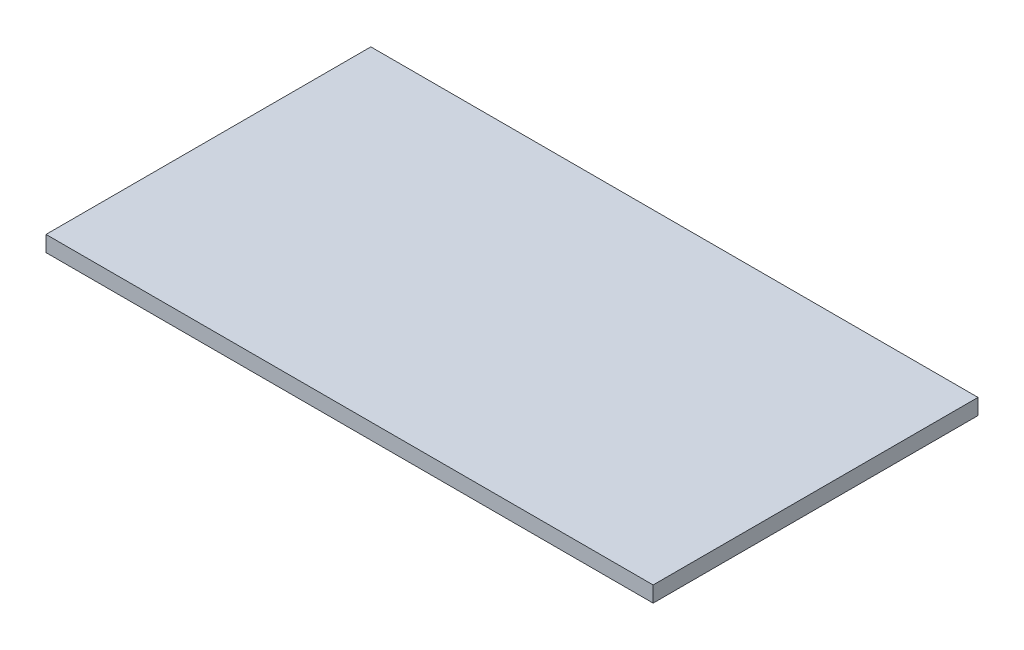
ISO-10303-21;
HEADER;
FILE_DESCRIPTION(('STEP AP214'),'2;1');
FILE_NAME('part.step','',(''),(''),'','','');
FILE_SCHEMA(('AUTOMOTIVE_DESIGN { 1 0 10303 214 1 1 1 1 }'));
ENDSEC;
DATA;
#1=APPLICATION_CONTEXT('core data for automotive mechanical design processes');
#2=APPLICATION_PROTOCOL_DEFINITION('international standard','automotive_design',2000,#1);
#3=PRODUCT_CONTEXT('',#1,'mechanical');
#4=PRODUCT('Part','Part','',(#3));
#5=PRODUCT_RELATED_PRODUCT_CATEGORY('part','',(#4));
#6=PRODUCT_DEFINITION_FORMATION('','',#4);
#7=PRODUCT_DEFINITION_CONTEXT('part definition',#1,'design');
#8=PRODUCT_DEFINITION('design','',#6,#7);
#9=PRODUCT_DEFINITION_SHAPE('','',#8);
#10=(LENGTH_UNIT() NAMED_UNIT(*) SI_UNIT(.MILLI.,.METRE.));
#11=(NAMED_UNIT(*) PLANE_ANGLE_UNIT() SI_UNIT($,.RADIAN.));
#12=(NAMED_UNIT(*) SI_UNIT($,.STERADIAN.) SOLID_ANGLE_UNIT());
#13=UNCERTAINTY_MEASURE_WITH_UNIT(LENGTH_MEASURE(1.E-05),#10,'distance_accuracy_value','');
#14=(GEOMETRIC_REPRESENTATION_CONTEXT(3) GLOBAL_UNCERTAINTY_ASSIGNED_CONTEXT((#13)) GLOBAL_UNIT_ASSIGNED_CONTEXT((#10,
#11,#12)) REPRESENTATION_CONTEXT('',''));
#15=CARTESIAN_POINT('',(0.,0.,0.));
#16=DIRECTION('',(0.,0.,1.));
#17=DIRECTION('',(1.,0.,0.));
#18=AXIS2_PLACEMENT_3D('',#15,#16,#17);
#19=CARTESIAN_POINT('',(0.,0.,0.));
#20=DIRECTION('',(0.,1.,0.));
#21=DIRECTION('',(0.,0.,1.));
#22=AXIS2_PLACEMENT_3D('',#19,#20,#21);
#23=PLANE('',#22);
#24=DIRECTION('',(1.,0.,0.));
#25=VECTOR('',#24,1.);
#26=CARTESIAN_POINT('',(-1925.,0.,1030.));
#27=LINE('',#26,#25);
#28=CARTESIAN_POINT('',(-1925.,0.,1030.));
#29=VERTEX_POINT('',#28);
#30=CARTESIAN_POINT('',(1925.,0.,1030.));
#31=VERTEX_POINT('',#30);
#32=EDGE_CURVE('E139',#29,#31,#27,.T.);
#33=ORIENTED_EDGE('',*,*,#32,.F.);
#34=DIRECTION('',(0.,0.,-1.));
#35=VECTOR('',#34,1.);
#36=CARTESIAN_POINT('',(-1925.,0.,1030.));
#37=LINE('',#36,#35);
#38=CARTESIAN_POINT('',(-1925.,0.,-1030.));
#39=VERTEX_POINT('',#38);
#40=EDGE_CURVE('E153',#29,#39,#37,.T.);
#41=ORIENTED_EDGE('',*,*,#40,.T.);
#42=DIRECTION('',(1.,0.,0.));
#43=VECTOR('',#42,1.);
#44=CARTESIAN_POINT('',(-1925.,0.,-1030.));
#45=LINE('',#44,#43);
#46=CARTESIAN_POINT('',(1925.,0.,-1030.));
#47=VERTEX_POINT('',#46);
#48=EDGE_CURVE('E166',#39,#47,#45,.T.);
#49=ORIENTED_EDGE('',*,*,#48,.T.);
#50=DIRECTION('',(0.,0.,-1.));
#51=VECTOR('',#50,1.);
#52=CARTESIAN_POINT('',(1925.,0.,1030.));
#53=LINE('',#52,#51);
#54=EDGE_CURVE('E144',#31,#47,#53,.T.);
#55=ORIENTED_EDGE('',*,*,#54,.F.);
#56=EDGE_LOOP('',(#33,#41,#49,#55));
#57=FACE_BOUND('',#56,.T.);
#58=DIRECTION('',(1.,0.,0.));
#59=VECTOR('',#58,1.);
#60=CARTESIAN_POINT('',(0.,0.,930.));
#61=LINE('',#60,#59);
#62=CARTESIAN_POINT('',(-1825.,0.,930.));
#63=VERTEX_POINT('',#62);
#64=CARTESIAN_POINT('',(1825.,0.,930.));
#65=VERTEX_POINT('',#64);
#66=EDGE_CURVE('E57',#63,#65,#61,.T.);
#67=ORIENTED_EDGE('',*,*,#66,.T.);
#68=DIRECTION('',(0.,0.,-1.));
#69=VECTOR('',#68,1.);
#70=CARTESIAN_POINT('',(1825.,0.,0.));
#71=LINE('',#70,#69);
#72=CARTESIAN_POINT('',(1825.,0.,-930.));
#73=VERTEX_POINT('',#72);
#74=EDGE_CURVE('E137',#65,#73,#71,.T.);
#75=ORIENTED_EDGE('',*,*,#74,.T.);
#76=DIRECTION('',(1.,0.,0.));
#77=VECTOR('',#76,1.);
#78=CARTESIAN_POINT('',(0.,0.,-930.));
#79=LINE('',#78,#77);
#80=CARTESIAN_POINT('',(-1825.,0.,-930.));
#81=VERTEX_POINT('',#80);
#82=EDGE_CURVE('E286',#81,#73,#79,.T.);
#83=ORIENTED_EDGE('',*,*,#82,.F.);
#84=DIRECTION('',(0.,0.,-1.));
#85=VECTOR('',#84,1.);
#86=CARTESIAN_POINT('',(-1825.,0.,0.));
#87=LINE('',#86,#85);
#88=EDGE_CURVE('E133',#63,#81,#87,.T.);
#89=ORIENTED_EDGE('',*,*,#88,.F.);
#90=EDGE_LOOP('',(#67,#75,#83,#89));
#91=FACE_BOUND('',#90,.T.);
#92=ADVANCED_FACE('F41',(#57,#91),#23,.F.);
#93=CARTESIAN_POINT('',(-1925.,100.,1030.));
#94=DIRECTION('',(0.,0.,-1.));
#95=DIRECTION('',(-1.,0.,0.));
#96=AXIS2_PLACEMENT_3D('',#93,#94,#95);
#97=PLANE('',#96);
#98=ORIENTED_EDGE('',*,*,#32,.T.);
#99=DIRECTION('',(0.,-1.,0.));
#100=VECTOR('',#99,1.);
#101=CARTESIAN_POINT('',(1925.,100.,1030.));
#102=LINE('',#101,#100);
#103=CARTESIAN_POINT('',(1925.,100.,1030.));
#104=VERTEX_POINT('',#103);
#105=EDGE_CURVE('E11',#104,#31,#102,.T.);
#106=ORIENTED_EDGE('',*,*,#105,.F.);
#107=DIRECTION('',(1.,0.,0.));
#108=VECTOR('',#107,1.);
#109=CARTESIAN_POINT('',(-1925.,100.,1030.));
#110=LINE('',#109,#108);
#111=CARTESIAN_POINT('',(-1925.,100.,1030.));
#112=VERTEX_POINT('',#111);
#113=EDGE_CURVE('E150',#112,#104,#110,.T.);
#114=ORIENTED_EDGE('',*,*,#113,.F.);
#115=DIRECTION('',(0.,-1.,0.));
#116=VECTOR('',#115,1.);
#117=CARTESIAN_POINT('',(-1925.,100.,1030.));
#118=LINE('',#117,#116);
#119=EDGE_CURVE('E66',#112,#29,#118,.T.);
#120=ORIENTED_EDGE('',*,*,#119,.T.);
#121=EDGE_LOOP('',(#98,#106,#114,#120));
#122=FACE_BOUND('',#121,.T.);
#123=ADVANCED_FACE('F43',(#122),#97,.F.);
#124=CARTESIAN_POINT('',(1925.,100.,1030.));
#125=DIRECTION('',(-1.,0.,0.));
#126=DIRECTION('',(0.,0.,1.));
#127=AXIS2_PLACEMENT_3D('',#124,#125,#126);
#128=PLANE('',#127);
#129=ORIENTED_EDGE('',*,*,#54,.T.);
#130=DIRECTION('',(0.,-1.,0.));
#131=VECTOR('',#130,1.);
#132=CARTESIAN_POINT('',(1925.,100.,-1030.));
#133=LINE('',#132,#131);
#134=CARTESIAN_POINT('',(1925.,100.,-1030.));
#135=VERTEX_POINT('',#134);
#136=EDGE_CURVE('E50',#135,#47,#133,.T.);
#137=ORIENTED_EDGE('',*,*,#136,.F.);
#138=DIRECTION('',(0.,0.,-1.));
#139=VECTOR('',#138,1.);
#140=CARTESIAN_POINT('',(1925.,100.,1030.));
#141=LINE('',#140,#139);
#142=EDGE_CURVE('E92',#104,#135,#141,.T.);
#143=ORIENTED_EDGE('',*,*,#142,.F.);
#144=ORIENTED_EDGE('',*,*,#105,.T.);
#145=EDGE_LOOP('',(#129,#137,#143,#144));
#146=FACE_BOUND('',#145,.T.);
#147=ADVANCED_FACE('F182',(#146),#128,.F.);
#148=CARTESIAN_POINT('',(-1925.,100.,-1030.));
#149=DIRECTION('',(0.,0.,-1.));
#150=DIRECTION('',(-1.,0.,0.));
#151=AXIS2_PLACEMENT_3D('',#148,#149,#150);
#152=PLANE('',#151);
#153=ORIENTED_EDGE('',*,*,#48,.F.);
#154=DIRECTION('',(0.,-1.,0.));
#155=VECTOR('',#154,1.);
#156=CARTESIAN_POINT('',(-1925.,100.,-1030.));
#157=LINE('',#156,#155);
#158=CARTESIAN_POINT('',(-1925.,100.,-1030.));
#159=VERTEX_POINT('',#158);
#160=EDGE_CURVE('E175',#159,#39,#157,.T.);
#161=ORIENTED_EDGE('',*,*,#160,.F.);
#162=DIRECTION('',(1.,0.,0.));
#163=VECTOR('',#162,1.);
#164=CARTESIAN_POINT('',(-1925.,100.,-1030.));
#165=LINE('',#164,#163);
#166=EDGE_CURVE('E156',#159,#135,#165,.T.);
#167=ORIENTED_EDGE('',*,*,#166,.T.);
#168=ORIENTED_EDGE('',*,*,#136,.T.);
#169=EDGE_LOOP('',(#153,#161,#167,#168));
#170=FACE_BOUND('',#169,.T.);
#171=ADVANCED_FACE('F180',(#170),#152,.T.);
#172=CARTESIAN_POINT('',(-1925.,100.,1030.));
#173=DIRECTION('',(-1.,0.,0.));
#174=DIRECTION('',(0.,0.,1.));
#175=AXIS2_PLACEMENT_3D('',#172,#173,#174);
#176=PLANE('',#175);
#177=ORIENTED_EDGE('',*,*,#40,.F.);
#178=ORIENTED_EDGE('',*,*,#119,.F.);
#179=DIRECTION('',(0.,0.,-1.));
#180=VECTOR('',#179,1.);
#181=CARTESIAN_POINT('',(-1925.,100.,1030.));
#182=LINE('',#181,#180);
#183=EDGE_CURVE('E160',#112,#159,#182,.T.);
#184=ORIENTED_EDGE('',*,*,#183,.T.);
#185=ORIENTED_EDGE('',*,*,#160,.T.);
#186=EDGE_LOOP('',(#177,#178,#184,#185));
#187=FACE_BOUND('',#186,.T.);
#188=ADVANCED_FACE('F186',(#187),#176,.T.);
#189=CARTESIAN_POINT('',(0.,100.,0.));
#190=DIRECTION('',(0.,1.,0.));
#191=DIRECTION('',(0.,0.,1.));
#192=AXIS2_PLACEMENT_3D('',#189,#190,#191);
#193=PLANE('',#192);
#194=ORIENTED_EDGE('',*,*,#113,.T.);
#195=ORIENTED_EDGE('',*,*,#142,.T.);
#196=ORIENTED_EDGE('',*,*,#166,.F.);
#197=ORIENTED_EDGE('',*,*,#183,.F.);
#198=EDGE_LOOP('',(#194,#195,#196,#197));
#199=FACE_BOUND('',#198,.T.);
#200=ADVANCED_FACE('F189',(#199),#193,.T.);
#201=CARTESIAN_POINT('',(0.,60.,930.));
#202=DIRECTION('',(0.,0.,-1.));
#203=DIRECTION('',(-1.,0.,0.));
#204=AXIS2_PLACEMENT_3D('',#201,#202,#203);
#205=PLANE('',#204);
#206=ORIENTED_EDGE('',*,*,#66,.F.);
#207=DIRECTION('',(0.,-1.,0.));
#208=VECTOR('',#207,1.);
#209=CARTESIAN_POINT('',(-1825.,60.,930.));
#210=LINE('',#209,#208);
#211=CARTESIAN_POINT('',(-1825.,60.,930.));
#212=VERTEX_POINT('',#211);
#213=EDGE_CURVE('E131',#212,#63,#210,.T.);
#214=ORIENTED_EDGE('',*,*,#213,.F.);
#215=DIRECTION('',(1.,0.,0.));
#216=VECTOR('',#215,1.);
#217=CARTESIAN_POINT('',(0.,60.,930.));
#218=LINE('',#217,#216);
#219=CARTESIAN_POINT('',(1825.,60.,930.));
#220=VERTEX_POINT('',#219);
#221=EDGE_CURVE('E120',#212,#220,#218,.T.);
#222=ORIENTED_EDGE('',*,*,#221,.T.);
#223=DIRECTION('',(0.,-1.,0.));
#224=VECTOR('',#223,1.);
#225=CARTESIAN_POINT('',(1825.,60.,930.));
#226=LINE('',#225,#224);
#227=EDGE_CURVE('E130',#220,#65,#226,.T.);
#228=ORIENTED_EDGE('',*,*,#227,.T.);
#229=EDGE_LOOP('',(#206,#214,#222,#228));
#230=FACE_BOUND('',#229,.T.);
#231=ADVANCED_FACE('F129',(#230),#205,.T.);
#232=CARTESIAN_POINT('',(1825.,60.,0.));
#233=DIRECTION('',(-1.,0.,0.));
#234=DIRECTION('',(0.,0.,1.));
#235=AXIS2_PLACEMENT_3D('',#232,#233,#234);
#236=PLANE('',#235);
#237=ORIENTED_EDGE('',*,*,#74,.F.);
#238=ORIENTED_EDGE('',*,*,#227,.F.);
#239=DIRECTION('',(0.,0.,-1.));
#240=VECTOR('',#239,1.);
#241=CARTESIAN_POINT('',(1825.,60.,0.));
#242=LINE('',#241,#240);
#243=CARTESIAN_POINT('',(1825.,60.,-930.));
#244=VERTEX_POINT('',#243);
#245=EDGE_CURVE('E116',#220,#244,#242,.T.);
#246=ORIENTED_EDGE('',*,*,#245,.T.);
#247=DIRECTION('',(0.,-1.,0.));
#248=VECTOR('',#247,1.);
#249=CARTESIAN_POINT('',(1825.,60.,-930.));
#250=LINE('',#249,#248);
#251=EDGE_CURVE('E140',#244,#73,#250,.T.);
#252=ORIENTED_EDGE('',*,*,#251,.T.);
#253=EDGE_LOOP('',(#237,#238,#246,#252));
#254=FACE_BOUND('',#253,.T.);
#255=ADVANCED_FACE('F135',(#254),#236,.T.);
#256=CARTESIAN_POINT('',(0.,60.,-930.));
#257=DIRECTION('',(0.,0.,-1.));
#258=DIRECTION('',(-1.,0.,0.));
#259=AXIS2_PLACEMENT_3D('',#256,#257,#258);
#260=PLANE('',#259);
#261=ORIENTED_EDGE('',*,*,#82,.T.);
#262=ORIENTED_EDGE('',*,*,#251,.F.);
#263=DIRECTION('',(1.,0.,0.));
#264=VECTOR('',#263,1.);
#265=CARTESIAN_POINT('',(0.,60.,-930.));
#266=LINE('',#265,#264);
#267=CARTESIAN_POINT('',(-1825.,60.,-930.));
#268=VERTEX_POINT('',#267);
#269=EDGE_CURVE('E123',#268,#244,#266,.T.);
#270=ORIENTED_EDGE('',*,*,#269,.F.);
#271=DIRECTION('',(0.,-1.,0.));
#272=VECTOR('',#271,1.);
#273=CARTESIAN_POINT('',(-1825.,60.,-930.));
#274=LINE('',#273,#272);
#275=EDGE_CURVE('E146',#268,#81,#274,.T.);
#276=ORIENTED_EDGE('',*,*,#275,.T.);
#277=EDGE_LOOP('',(#261,#262,#270,#276));
#278=FACE_BOUND('',#277,.T.);
#279=ADVANCED_FACE('F228',(#278),#260,.F.);
#280=CARTESIAN_POINT('',(-1825.,60.,0.));
#281=DIRECTION('',(-1.,0.,0.));
#282=DIRECTION('',(0.,0.,1.));
#283=AXIS2_PLACEMENT_3D('',#280,#281,#282);
#284=PLANE('',#283);
#285=ORIENTED_EDGE('',*,*,#88,.T.);
#286=ORIENTED_EDGE('',*,*,#275,.F.);
#287=DIRECTION('',(0.,0.,-1.));
#288=VECTOR('',#287,1.);
#289=CARTESIAN_POINT('',(-1825.,60.,0.));
#290=LINE('',#289,#288);
#291=EDGE_CURVE('E296',#212,#268,#290,.T.);
#292=ORIENTED_EDGE('',*,*,#291,.F.);
#293=ORIENTED_EDGE('',*,*,#213,.T.);
#294=EDGE_LOOP('',(#285,#286,#292,#293));
#295=FACE_BOUND('',#294,.T.);
#296=ADVANCED_FACE('F235',(#295),#284,.F.);
#297=CARTESIAN_POINT('',(0.,60.,0.));
#298=DIRECTION('',(0.,1.,0.));
#299=DIRECTION('',(0.,0.,1.));
#300=AXIS2_PLACEMENT_3D('',#297,#298,#299);
#301=PLANE('',#300);
#302=ORIENTED_EDGE('',*,*,#221,.F.);
#303=ORIENTED_EDGE('',*,*,#291,.T.);
#304=ORIENTED_EDGE('',*,*,#269,.T.);
#305=ORIENTED_EDGE('',*,*,#245,.F.);
#306=EDGE_LOOP('',(#302,#303,#304,#305));
#307=FACE_BOUND('',#306,.T.);
#308=ADVANCED_FACE('F118',(#307),#301,.F.);
#309=CLOSED_SHELL('',(#92,#123,#147,#171,#188,#200,#231,#255,#279,#296,#308));
#310=MANIFOLD_SOLID_BREP('B2',#309);
#311=ADVANCED_BREP_SHAPE_REPRESENTATION('',(#18,#310),#14);
#312=SHAPE_DEFINITION_REPRESENTATION(#9,#311);
ENDSEC;
END-ISO-10303-21;
